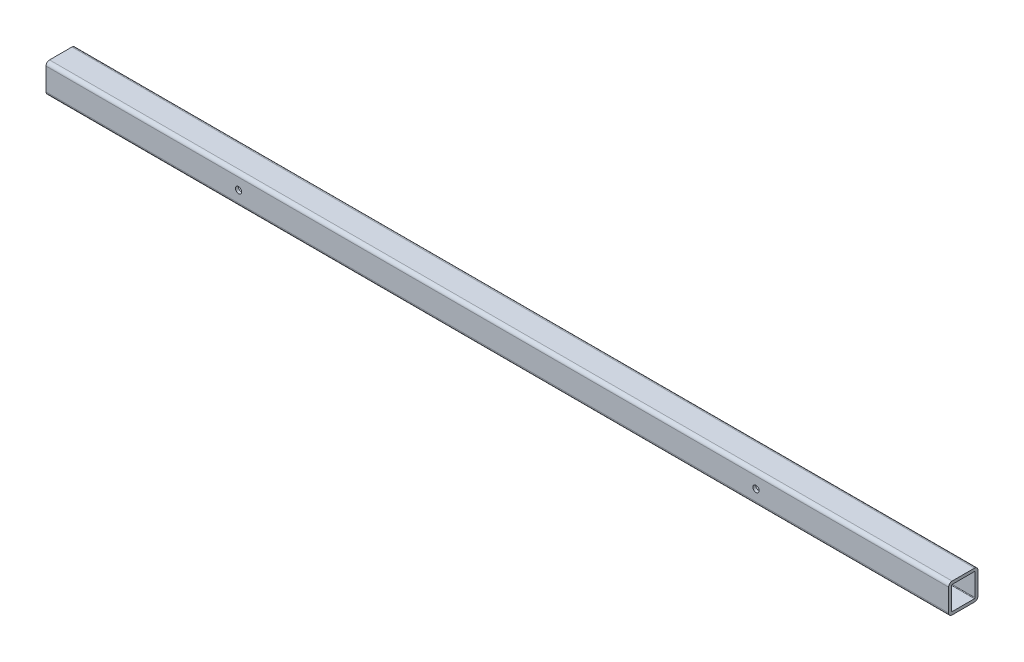
ISO-10303-21;
HEADER;
FILE_DESCRIPTION(('STEP AP214'),'2;1');
FILE_NAME('part.step','',(''),(''),'','','');
FILE_SCHEMA(('AUTOMOTIVE_DESIGN { 1 0 10303 214 1 1 1 1 }'));
ENDSEC;
DATA;
#1=APPLICATION_CONTEXT('core data for automotive mechanical design processes');
#2=APPLICATION_PROTOCOL_DEFINITION('international standard','automotive_design',2000,#1);
#3=PRODUCT_CONTEXT('',#1,'mechanical');
#4=PRODUCT('Part','Part','',(#3));
#5=PRODUCT_RELATED_PRODUCT_CATEGORY('part','',(#4));
#6=PRODUCT_DEFINITION_FORMATION('','',#4);
#7=PRODUCT_DEFINITION_CONTEXT('part definition',#1,'design');
#8=PRODUCT_DEFINITION('design','',#6,#7);
#9=PRODUCT_DEFINITION_SHAPE('','',#8);
#10=(LENGTH_UNIT() NAMED_UNIT(*) SI_UNIT(.MILLI.,.METRE.));
#11=(NAMED_UNIT(*) PLANE_ANGLE_UNIT() SI_UNIT($,.RADIAN.));
#12=(NAMED_UNIT(*) SI_UNIT($,.STERADIAN.) SOLID_ANGLE_UNIT());
#13=UNCERTAINTY_MEASURE_WITH_UNIT(LENGTH_MEASURE(1.E-05),#10,'distance_accuracy_value','');
#14=(GEOMETRIC_REPRESENTATION_CONTEXT(3) GLOBAL_UNCERTAINTY_ASSIGNED_CONTEXT((#13)) GLOBAL_UNIT_ASSIGNED_CONTEXT((#10,
#11,#12)) REPRESENTATION_CONTEXT('',''));
#15=CARTESIAN_POINT('',(0.,0.,0.));
#16=DIRECTION('',(0.,0.,1.));
#17=DIRECTION('',(1.,0.,0.));
#18=AXIS2_PLACEMENT_3D('',#15,#16,#17);
#19=CARTESIAN_POINT('',(-487.3625,3.81,27.94));
#20=DIRECTION('',(1.,0.,0.));
#21=DIRECTION('',(0.,0.,-1.));
#22=AXIS2_PLACEMENT_3D('',#19,#20,#21);
#23=CYLINDRICAL_SURFACE('',#22,0.635);
#24=DIRECTION('',(-1.,0.,0.));
#25=VECTOR('',#24,1.);
#26=CARTESIAN_POINT('',(-487.3625,3.81,28.575));
#27=LINE('',#26,#25);
#28=CARTESIAN_POINT('',(487.3625,3.81,28.575));
#29=VERTEX_POINT('',#28);
#30=CARTESIAN_POINT('',(-487.3625,3.81,28.575));
#31=VERTEX_POINT('',#30);
#32=EDGE_CURVE('E138',#29,#31,#27,.T.);
#33=ORIENTED_EDGE('',*,*,#32,.F.);
#34=CARTESIAN_POINT('',(487.3625,3.81,27.94));
#35=DIRECTION('',(1.,0.,0.));
#36=DIRECTION('',(0.,0.,-1.));
#37=AXIS2_PLACEMENT_3D('',#34,#35,#36);
#38=CIRCLE('',#37,0.635);
#39=CARTESIAN_POINT('',(487.3625,3.175,27.94));
#40=VERTEX_POINT('',#39);
#41=EDGE_CURVE('E19',#40,#29,#38,.F.);
#42=ORIENTED_EDGE('',*,*,#41,.F.);
#43=DIRECTION('',(1.,0.,0.));
#44=VECTOR('',#43,1.);
#45=CARTESIAN_POINT('',(-487.3625,3.175,27.94));
#46=LINE('',#45,#44);
#47=CARTESIAN_POINT('',(-487.3625,3.175,27.94));
#48=VERTEX_POINT('',#47);
#49=EDGE_CURVE('E218',#48,#40,#46,.T.);
#50=ORIENTED_EDGE('',*,*,#49,.F.);
#51=CARTESIAN_POINT('',(-487.3625,3.81,27.94));
#52=DIRECTION('',(1.,0.,0.));
#53=DIRECTION('',(0.,0.,-1.));
#54=AXIS2_PLACEMENT_3D('',#51,#52,#53);
#55=CIRCLE('',#54,0.635);
#56=EDGE_CURVE('E136',#31,#48,#55,.T.);
#57=ORIENTED_EDGE('',*,*,#56,.F.);
#58=EDGE_LOOP('',(#33,#42,#50,#57));
#59=FACE_BOUND('',#58,.T.);
#60=ADVANCED_FACE('F16',(#59),#23,.F.);
#61=CARTESIAN_POINT('',(-487.3625,27.94,27.94));
#62=DIRECTION('',(1.,0.,0.));
#63=DIRECTION('',(0.,0.,-1.));
#64=AXIS2_PLACEMENT_3D('',#61,#62,#63);
#65=CYLINDRICAL_SURFACE('',#64,0.635);
#66=DIRECTION('',(1.,0.,0.));
#67=VECTOR('',#66,1.);
#68=CARTESIAN_POINT('',(-487.3625,28.575,27.94));
#69=LINE('',#68,#67);
#70=CARTESIAN_POINT('',(487.3625,28.575,27.94));
#71=VERTEX_POINT('',#70);
#72=CARTESIAN_POINT('',(-487.3625,28.575,27.94));
#73=VERTEX_POINT('',#72);
#74=EDGE_CURVE('E207',#71,#73,#69,.F.);
#75=ORIENTED_EDGE('',*,*,#74,.F.);
#76=CARTESIAN_POINT('',(487.3625,27.94,27.94));
#77=DIRECTION('',(1.,0.,0.));
#78=DIRECTION('',(0.,0.,-1.));
#79=AXIS2_PLACEMENT_3D('',#76,#77,#78);
#80=CIRCLE('',#79,0.635);
#81=CARTESIAN_POINT('',(487.3625,27.94,28.575));
#82=VERTEX_POINT('',#81);
#83=EDGE_CURVE('E278',#82,#71,#80,.F.);
#84=ORIENTED_EDGE('',*,*,#83,.F.);
#85=DIRECTION('',(-1.,0.,0.));
#86=VECTOR('',#85,1.);
#87=CARTESIAN_POINT('',(-487.3625,27.94,28.575));
#88=LINE('',#87,#86);
#89=CARTESIAN_POINT('',(-487.3625,27.94,28.575));
#90=VERTEX_POINT('',#89);
#91=EDGE_CURVE('E143',#90,#82,#88,.F.);
#92=ORIENTED_EDGE('',*,*,#91,.F.);
#93=CARTESIAN_POINT('',(-487.3625,27.94,27.94));
#94=DIRECTION('',(1.,0.,0.));
#95=DIRECTION('',(0.,0.,-1.));
#96=AXIS2_PLACEMENT_3D('',#93,#94,#95);
#97=CIRCLE('',#96,0.635);
#98=EDGE_CURVE('E276',#73,#90,#97,.T.);
#99=ORIENTED_EDGE('',*,*,#98,.F.);
#100=EDGE_LOOP('',(#75,#84,#92,#99));
#101=FACE_BOUND('',#100,.T.);
#102=ADVANCED_FACE('F304',(#101),#65,.F.);
#103=CARTESIAN_POINT('',(-487.3625,3.81,3.81));
#104=DIRECTION('',(1.,0.,0.));
#105=DIRECTION('',(0.,0.,-1.));
#106=AXIS2_PLACEMENT_3D('',#103,#104,#105);
#107=CYLINDRICAL_SURFACE('',#106,0.635);
#108=DIRECTION('',(1.,0.,0.));
#109=VECTOR('',#108,1.);
#110=CARTESIAN_POINT('',(-487.3625,3.175,3.81));
#111=LINE('',#110,#109);
#112=CARTESIAN_POINT('',(487.3625,3.175,3.81));
#113=VERTEX_POINT('',#112);
#114=CARTESIAN_POINT('',(-487.3625,3.175,3.81));
#115=VERTEX_POINT('',#114);
#116=EDGE_CURVE('E215',#113,#115,#111,.F.);
#117=ORIENTED_EDGE('',*,*,#116,.F.);
#118=CARTESIAN_POINT('',(487.3625,3.81,3.81));
#119=DIRECTION('',(1.,0.,0.));
#120=DIRECTION('',(0.,0.,-1.));
#121=AXIS2_PLACEMENT_3D('',#118,#119,#120);
#122=CIRCLE('',#121,0.635);
#123=CARTESIAN_POINT('',(487.3625,3.81,3.175));
#124=VERTEX_POINT('',#123);
#125=EDGE_CURVE('E274',#124,#113,#122,.F.);
#126=ORIENTED_EDGE('',*,*,#125,.F.);
#127=DIRECTION('',(1.,0.,0.));
#128=VECTOR('',#127,1.);
#129=CARTESIAN_POINT('',(-487.3625,3.81,3.175));
#130=LINE('',#129,#128);
#131=CARTESIAN_POINT('',(-487.3625,3.81,3.175));
#132=VERTEX_POINT('',#131);
#133=EDGE_CURVE('E204',#132,#124,#130,.T.);
#134=ORIENTED_EDGE('',*,*,#133,.F.);
#135=CARTESIAN_POINT('',(-487.3625,3.81,3.81));
#136=DIRECTION('',(1.,0.,0.));
#137=DIRECTION('',(0.,0.,-1.));
#138=AXIS2_PLACEMENT_3D('',#135,#136,#137);
#139=CIRCLE('',#138,0.635);
#140=EDGE_CURVE('E272',#115,#132,#139,.T.);
#141=ORIENTED_EDGE('',*,*,#140,.F.);
#142=EDGE_LOOP('',(#117,#126,#134,#141));
#143=FACE_BOUND('',#142,.T.);
#144=ADVANCED_FACE('F288',(#143),#107,.F.);
#145=CARTESIAN_POINT('',(-487.3625,27.94,3.81));
#146=DIRECTION('',(1.,0.,0.));
#147=DIRECTION('',(0.,0.,-1.));
#148=AXIS2_PLACEMENT_3D('',#145,#146,#147);
#149=CYLINDRICAL_SURFACE('',#148,0.635);
#150=DIRECTION('',(1.,0.,0.));
#151=VECTOR('',#150,1.);
#152=CARTESIAN_POINT('',(-487.3625,27.94,3.175));
#153=LINE('',#152,#151);
#154=CARTESIAN_POINT('',(487.3625,27.94,3.175));
#155=VERTEX_POINT('',#154);
#156=CARTESIAN_POINT('',(-487.3625,27.94,3.175));
#157=VERTEX_POINT('',#156);
#158=EDGE_CURVE('E200',#155,#157,#153,.F.);
#159=ORIENTED_EDGE('',*,*,#158,.F.);
#160=CARTESIAN_POINT('',(487.3625,27.94,3.81));
#161=DIRECTION('',(1.,0.,0.));
#162=DIRECTION('',(0.,0.,-1.));
#163=AXIS2_PLACEMENT_3D('',#160,#161,#162);
#164=CIRCLE('',#163,0.635);
#165=CARTESIAN_POINT('',(487.3625,28.575,3.81));
#166=VERTEX_POINT('',#165);
#167=EDGE_CURVE('E270',#166,#155,#164,.F.);
#168=ORIENTED_EDGE('',*,*,#167,.F.);
#169=DIRECTION('',(1.,0.,0.));
#170=VECTOR('',#169,1.);
#171=CARTESIAN_POINT('',(-487.3625,28.575,3.81));
#172=LINE('',#171,#170);
#173=CARTESIAN_POINT('',(-487.3625,28.575,3.81));
#174=VERTEX_POINT('',#173);
#175=EDGE_CURVE('E210',#174,#166,#172,.T.);
#176=ORIENTED_EDGE('',*,*,#175,.F.);
#177=CARTESIAN_POINT('',(-487.3625,27.94,3.81));
#178=DIRECTION('',(1.,0.,0.));
#179=DIRECTION('',(0.,0.,-1.));
#180=AXIS2_PLACEMENT_3D('',#177,#178,#179);
#181=CIRCLE('',#180,0.635);
#182=EDGE_CURVE('E268',#157,#174,#181,.T.);
#183=ORIENTED_EDGE('',*,*,#182,.F.);
#184=EDGE_LOOP('',(#159,#168,#176,#183));
#185=FACE_BOUND('',#184,.T.);
#186=ADVANCED_FACE('F298',(#185),#149,.F.);
#187=CARTESIAN_POINT('',(-279.4,15.875,31.75));
#188=DIRECTION('',(0.,0.,1.));
#189=DIRECTION('',(1.,0.,0.));
#190=AXIS2_PLACEMENT_3D('',#187,#188,#189);
#191=CYLINDRICAL_SURFACE('',#190,3.3655);
#192=CARTESIAN_POINT('',(-279.4,15.875,3.175));
#193=DIRECTION('',(0.,0.,1.));
#194=DIRECTION('',(1.,0.,0.));
#195=AXIS2_PLACEMENT_3D('',#192,#193,#194);
#196=CIRCLE('',#195,3.3655);
#197=CARTESIAN_POINT('',(-276.0345,15.875,3.175));
#198=VERTEX_POINT('',#197);
#199=EDGE_CURVE('E203',#198,#198,#196,.F.);
#200=ORIENTED_EDGE('',*,*,#199,.F.);
#201=EDGE_LOOP('',(#200));
#202=FACE_BOUND('',#201,.T.);
#203=CARTESIAN_POINT('',(-279.4,15.875,0.));
#204=DIRECTION('',(0.,0.,1.));
#205=DIRECTION('',(1.,0.,0.));
#206=AXIS2_PLACEMENT_3D('',#203,#204,#205);
#207=CIRCLE('',#206,3.3655);
#208=CARTESIAN_POINT('',(-276.0345,15.875,0.));
#209=VERTEX_POINT('',#208);
#210=EDGE_CURVE('E265',#209,#209,#207,.T.);
#211=ORIENTED_EDGE('',*,*,#210,.F.);
#212=EDGE_LOOP('',(#211));
#213=FACE_BOUND('',#212,.T.);
#214=ADVANCED_FACE('F372',(#202,#213),#191,.F.);
#215=CARTESIAN_POINT('',(279.4,15.875,31.75));
#216=DIRECTION('',(0.,0.,1.));
#217=DIRECTION('',(1.,0.,0.));
#218=AXIS2_PLACEMENT_3D('',#215,#216,#217);
#219=CYLINDRICAL_SURFACE('',#218,3.3655);
#220=CARTESIAN_POINT('',(279.4,15.875,3.175));
#221=DIRECTION('',(0.,0.,1.));
#222=DIRECTION('',(1.,0.,0.));
#223=AXIS2_PLACEMENT_3D('',#220,#221,#222);
#224=CIRCLE('',#223,3.3655);
#225=CARTESIAN_POINT('',(282.7655,15.875,3.175));
#226=VERTEX_POINT('',#225);
#227=EDGE_CURVE('E227',#226,#226,#224,.F.);
#228=ORIENTED_EDGE('',*,*,#227,.F.);
#229=EDGE_LOOP('',(#228));
#230=FACE_BOUND('',#229,.T.);
#231=CARTESIAN_POINT('',(279.4,15.875,0.));
#232=DIRECTION('',(0.,0.,1.));
#233=DIRECTION('',(1.,0.,0.));
#234=AXIS2_PLACEMENT_3D('',#231,#232,#233);
#235=CIRCLE('',#234,3.3655);
#236=CARTESIAN_POINT('',(282.7655,15.875,0.));
#237=VERTEX_POINT('',#236);
#238=EDGE_CURVE('E235',#237,#237,#235,.T.);
#239=ORIENTED_EDGE('',*,*,#238,.F.);
#240=EDGE_LOOP('',(#239));
#241=FACE_BOUND('',#240,.T.);
#242=ADVANCED_FACE('F368',(#230,#241),#219,.F.);
#243=CARTESIAN_POINT('',(-279.4,15.875,31.75));
#244=DIRECTION('',(0.,0.,1.));
#245=DIRECTION('',(1.,0.,0.));
#246=AXIS2_PLACEMENT_3D('',#243,#244,#245);
#247=CYLINDRICAL_SURFACE('',#246,3.3655);
#248=CARTESIAN_POINT('',(-279.4,15.875,28.575));
#249=DIRECTION('',(0.,0.,1.));
#250=DIRECTION('',(1.,0.,0.));
#251=AXIS2_PLACEMENT_3D('',#248,#249,#250);
#252=CIRCLE('',#251,3.3655);
#253=CARTESIAN_POINT('',(-276.0345,15.875,28.575));
#254=VERTEX_POINT('',#253);
#255=EDGE_CURVE('E142',#254,#254,#252,.T.);
#256=ORIENTED_EDGE('',*,*,#255,.F.);
#257=EDGE_LOOP('',(#256));
#258=FACE_BOUND('',#257,.T.);
#259=CARTESIAN_POINT('',(-279.4,15.875,31.75));
#260=DIRECTION('',(0.,0.,1.));
#261=DIRECTION('',(1.,0.,0.));
#262=AXIS2_PLACEMENT_3D('',#259,#260,#261);
#263=CIRCLE('',#262,3.3655);
#264=CARTESIAN_POINT('',(-276.0345,15.875,31.75));
#265=VERTEX_POINT('',#264);
#266=EDGE_CURVE('E226',#265,#265,#263,.F.);
#267=ORIENTED_EDGE('',*,*,#266,.F.);
#268=EDGE_LOOP('',(#267));
#269=FACE_BOUND('',#268,.T.);
#270=ADVANCED_FACE('F364',(#258,#269),#247,.F.);
#271=CARTESIAN_POINT('',(279.4,15.875,31.75));
#272=DIRECTION('',(0.,0.,1.));
#273=DIRECTION('',(1.,0.,0.));
#274=AXIS2_PLACEMENT_3D('',#271,#272,#273);
#275=CYLINDRICAL_SURFACE('',#274,3.3655);
#276=CARTESIAN_POINT('',(279.4,15.875,28.575));
#277=DIRECTION('',(0.,0.,1.));
#278=DIRECTION('',(1.,0.,0.));
#279=AXIS2_PLACEMENT_3D('',#276,#277,#278);
#280=CIRCLE('',#279,3.3655);
#281=CARTESIAN_POINT('',(282.7655,15.875,28.575));
#282=VERTEX_POINT('',#281);
#283=EDGE_CURVE('E212',#282,#282,#280,.T.);
#284=ORIENTED_EDGE('',*,*,#283,.F.);
#285=EDGE_LOOP('',(#284));
#286=FACE_BOUND('',#285,.T.);
#287=CARTESIAN_POINT('',(279.4,15.875,31.75));
#288=DIRECTION('',(0.,0.,1.));
#289=DIRECTION('',(1.,0.,0.));
#290=AXIS2_PLACEMENT_3D('',#287,#288,#289);
#291=CIRCLE('',#290,3.3655);
#292=CARTESIAN_POINT('',(282.7655,15.875,31.75));
#293=VERTEX_POINT('',#292);
#294=EDGE_CURVE('E250',#293,#293,#291,.F.);
#295=ORIENTED_EDGE('',*,*,#294,.F.);
#296=EDGE_LOOP('',(#295));
#297=FACE_BOUND('',#296,.T.);
#298=ADVANCED_FACE('F360',(#286,#297),#275,.F.);
#299=CARTESIAN_POINT('',(-487.3625,3.81,0.));
#300=DIRECTION('',(0.,0.,-1.));
#301=DIRECTION('',(-1.,0.,0.));
#302=AXIS2_PLACEMENT_3D('',#299,#300,#301);
#303=PLANE('',#302);
#304=ORIENTED_EDGE('',*,*,#238,.T.);
#305=EDGE_LOOP('',(#304));
#306=FACE_BOUND('',#305,.T.);
#307=ORIENTED_EDGE('',*,*,#210,.T.);
#308=EDGE_LOOP('',(#307));
#309=FACE_BOUND('',#308,.T.);
#310=DIRECTION('',(0.,1.,0.));
#311=VECTOR('',#310,1.);
#312=CARTESIAN_POINT('',(487.3625,0.,0.));
#313=LINE('',#312,#311);
#314=CARTESIAN_POINT('',(487.3625,3.81,0.));
#315=VERTEX_POINT('',#314);
#316=CARTESIAN_POINT('',(487.3625,27.94,0.));
#317=VERTEX_POINT('',#316);
#318=EDGE_CURVE('E164',#315,#317,#313,.T.);
#319=ORIENTED_EDGE('',*,*,#318,.F.);
#320=DIRECTION('',(1.,0.,0.));
#321=VECTOR('',#320,1.);
#322=CARTESIAN_POINT('',(-487.3625,3.81,0.));
#323=LINE('',#322,#321);
#324=CARTESIAN_POINT('',(-487.3625,3.81,0.));
#325=VERTEX_POINT('',#324);
#326=EDGE_CURVE('E167',#325,#315,#323,.T.);
#327=ORIENTED_EDGE('',*,*,#326,.F.);
#328=DIRECTION('',(0.,1.,0.));
#329=VECTOR('',#328,1.);
#330=CARTESIAN_POINT('',(-487.3625,0.,0.));
#331=LINE('',#330,#329);
#332=CARTESIAN_POINT('',(-487.3625,27.94,0.));
#333=VERTEX_POINT('',#332);
#334=EDGE_CURVE('E189',#325,#333,#331,.T.);
#335=ORIENTED_EDGE('',*,*,#334,.T.);
#336=DIRECTION('',(1.,0.,0.));
#337=VECTOR('',#336,1.);
#338=CARTESIAN_POINT('',(-487.3625,27.94,0.));
#339=LINE('',#338,#337);
#340=EDGE_CURVE('E233',#317,#333,#339,.F.);
#341=ORIENTED_EDGE('',*,*,#340,.F.);
#342=EDGE_LOOP('',(#319,#327,#335,#341));
#343=FACE_BOUND('',#342,.T.);
#344=ADVANCED_FACE('F356',(#306,#309,#343),#303,.T.);
#345=CARTESIAN_POINT('',(-487.3625,27.94,3.81));
#346=DIRECTION('',(1.,0.,0.));
#347=DIRECTION('',(0.,0.,-1.));
#348=AXIS2_PLACEMENT_3D('',#345,#346,#347);
#349=CYLINDRICAL_SURFACE('',#348,3.81);
#350=CARTESIAN_POINT('',(487.3625,27.94,3.81));
#351=DIRECTION('',(1.,0.,0.));
#352=DIRECTION('',(0.,0.,-1.));
#353=AXIS2_PLACEMENT_3D('',#350,#351,#352);
#354=CIRCLE('',#353,3.81);
#355=CARTESIAN_POINT('',(487.3625,31.75,3.81));
#356=VERTEX_POINT('',#355);
#357=EDGE_CURVE('E163',#317,#356,#354,.T.);
#358=ORIENTED_EDGE('',*,*,#357,.F.);
#359=ORIENTED_EDGE('',*,*,#340,.T.);
#360=CARTESIAN_POINT('',(-487.3625,27.94,3.81));
#361=DIRECTION('',(1.,0.,0.));
#362=DIRECTION('',(0.,0.,-1.));
#363=AXIS2_PLACEMENT_3D('',#360,#361,#362);
#364=CIRCLE('',#363,3.81);
#365=CARTESIAN_POINT('',(-487.3625,31.75,3.81));
#366=VERTEX_POINT('',#365);
#367=EDGE_CURVE('E197',#333,#366,#364,.T.);
#368=ORIENTED_EDGE('',*,*,#367,.T.);
#369=DIRECTION('',(1.,0.,0.));
#370=VECTOR('',#369,1.);
#371=CARTESIAN_POINT('',(-487.3625,31.75,3.81));
#372=LINE('',#371,#370);
#373=EDGE_CURVE('E230',#356,#366,#372,.F.);
#374=ORIENTED_EDGE('',*,*,#373,.F.);
#375=EDGE_LOOP('',(#358,#359,#368,#374));
#376=FACE_BOUND('',#375,.T.);
#377=ADVANCED_FACE('F352',(#376),#349,.T.);
#378=CARTESIAN_POINT('',(-487.3625,31.75,3.81));
#379=DIRECTION('',(0.,1.,0.));
#380=DIRECTION('',(0.,0.,1.));
#381=AXIS2_PLACEMENT_3D('',#378,#379,#380);
#382=PLANE('',#381);
#383=DIRECTION('',(0.,0.,-1.));
#384=VECTOR('',#383,1.);
#385=CARTESIAN_POINT('',(487.3625,31.75,0.));
#386=LINE('',#385,#384);
#387=CARTESIAN_POINT('',(487.3625,31.75,27.94));
#388=VERTEX_POINT('',#387);
#389=EDGE_CURVE('E160',#356,#388,#386,.F.);
#390=ORIENTED_EDGE('',*,*,#389,.F.);
#391=ORIENTED_EDGE('',*,*,#373,.T.);
#392=DIRECTION('',(0.,0.,-1.));
#393=VECTOR('',#392,1.);
#394=CARTESIAN_POINT('',(-487.3625,31.75,0.));
#395=LINE('',#394,#393);
#396=CARTESIAN_POINT('',(-487.3625,31.75,27.94));
#397=VERTEX_POINT('',#396);
#398=EDGE_CURVE('E195',#366,#397,#395,.F.);
#399=ORIENTED_EDGE('',*,*,#398,.T.);
#400=DIRECTION('',(1.,0.,0.));
#401=VECTOR('',#400,1.);
#402=CARTESIAN_POINT('',(-487.3625,31.75,27.94));
#403=LINE('',#402,#401);
#404=EDGE_CURVE('E220',#388,#397,#403,.F.);
#405=ORIENTED_EDGE('',*,*,#404,.F.);
#406=EDGE_LOOP('',(#390,#391,#399,#405));
#407=FACE_BOUND('',#406,.T.);
#408=ADVANCED_FACE('F348',(#407),#382,.T.);
#409=CARTESIAN_POINT('',(-487.3625,27.94,27.94));
#410=DIRECTION('',(1.,0.,0.));
#411=DIRECTION('',(0.,0.,-1.));
#412=AXIS2_PLACEMENT_3D('',#409,#410,#411);
#413=CYLINDRICAL_SURFACE('',#412,3.81);
#414=CARTESIAN_POINT('',(487.3625,27.94,27.94));
#415=DIRECTION('',(1.,0.,0.));
#416=DIRECTION('',(0.,0.,-1.));
#417=AXIS2_PLACEMENT_3D('',#414,#415,#416);
#418=CIRCLE('',#417,3.81);
#419=CARTESIAN_POINT('',(487.3625,27.94,31.75));
#420=VERTEX_POINT('',#419);
#421=EDGE_CURVE('E159',#388,#420,#418,.T.);
#422=ORIENTED_EDGE('',*,*,#421,.F.);
#423=ORIENTED_EDGE('',*,*,#404,.T.);
#424=CARTESIAN_POINT('',(-487.3625,27.94,27.94));
#425=DIRECTION('',(1.,0.,0.));
#426=DIRECTION('',(0.,0.,-1.));
#427=AXIS2_PLACEMENT_3D('',#424,#425,#426);
#428=CIRCLE('',#427,3.81);
#429=CARTESIAN_POINT('',(-487.3625,27.94,31.75));
#430=VERTEX_POINT('',#429);
#431=EDGE_CURVE('E194',#397,#430,#428,.T.);
#432=ORIENTED_EDGE('',*,*,#431,.T.);
#433=DIRECTION('',(1.,0.,0.));
#434=VECTOR('',#433,1.);
#435=CARTESIAN_POINT('',(-487.3625,27.94,31.75));
#436=LINE('',#435,#434);
#437=EDGE_CURVE('E223',#420,#430,#436,.F.);
#438=ORIENTED_EDGE('',*,*,#437,.F.);
#439=EDGE_LOOP('',(#422,#423,#432,#438));
#440=FACE_BOUND('',#439,.T.);
#441=ADVANCED_FACE('F345',(#440),#413,.T.);
#442=CARTESIAN_POINT('',(-487.3625,3.175,3.81));
#443=DIRECTION('',(0.,1.,0.));
#444=DIRECTION('',(0.,0.,1.));
#445=AXIS2_PLACEMENT_3D('',#442,#443,#444);
#446=PLANE('',#445);
#447=DIRECTION('',(0.,0.,-1.));
#448=VECTOR('',#447,1.);
#449=CARTESIAN_POINT('',(487.3625,3.175,0.));
#450=LINE('',#449,#448);
#451=EDGE_CURVE('E135',#113,#40,#450,.F.);
#452=ORIENTED_EDGE('',*,*,#451,.F.);
#453=ORIENTED_EDGE('',*,*,#116,.T.);
#454=DIRECTION('',(0.,0.,-1.));
#455=VECTOR('',#454,1.);
#456=CARTESIAN_POINT('',(-487.3625,3.175,0.));
#457=LINE('',#456,#455);
#458=EDGE_CURVE('E186',#115,#48,#457,.F.);
#459=ORIENTED_EDGE('',*,*,#458,.T.);
#460=ORIENTED_EDGE('',*,*,#49,.T.);
#461=EDGE_LOOP('',(#452,#453,#459,#460));
#462=FACE_BOUND('',#461,.T.);
#463=ADVANCED_FACE('F285',(#462),#446,.T.);
#464=CARTESIAN_POINT('',(-487.3625,3.81,28.575));
#465=DIRECTION('',(0.,0.,-1.));
#466=DIRECTION('',(-1.,0.,0.));
#467=AXIS2_PLACEMENT_3D('',#464,#465,#466);
#468=PLANE('',#467);
#469=ORIENTED_EDGE('',*,*,#283,.T.);
#470=EDGE_LOOP('',(#469));
#471=FACE_BOUND('',#470,.T.);
#472=ORIENTED_EDGE('',*,*,#255,.T.);
#473=EDGE_LOOP('',(#472));
#474=FACE_BOUND('',#473,.T.);
#475=DIRECTION('',(0.,1.,0.));
#476=VECTOR('',#475,1.);
#477=CARTESIAN_POINT('',(487.3625,0.,28.575));
#478=LINE('',#477,#476);
#479=EDGE_CURVE('E133',#29,#82,#478,.T.);
#480=ORIENTED_EDGE('',*,*,#479,.F.);
#481=ORIENTED_EDGE('',*,*,#32,.T.);
#482=DIRECTION('',(0.,1.,0.));
#483=VECTOR('',#482,1.);
#484=CARTESIAN_POINT('',(-487.3625,0.,28.575));
#485=LINE('',#484,#483);
#486=EDGE_CURVE('E184',#31,#90,#485,.T.);
#487=ORIENTED_EDGE('',*,*,#486,.T.);
#488=ORIENTED_EDGE('',*,*,#91,.T.);
#489=EDGE_LOOP('',(#480,#481,#487,#488));
#490=FACE_BOUND('',#489,.T.);
#491=ADVANCED_FACE('F146',(#471,#474,#490),#468,.T.);
#492=CARTESIAN_POINT('',(-487.3625,28.575,27.94));
#493=DIRECTION('',(0.,-1.,0.));
#494=DIRECTION('',(0.,0.,-1.));
#495=AXIS2_PLACEMENT_3D('',#492,#493,#494);
#496=PLANE('',#495);
#497=DIRECTION('',(0.,0.,-1.));
#498=VECTOR('',#497,1.);
#499=CARTESIAN_POINT('',(487.3625,28.575,0.));
#500=LINE('',#499,#498);
#501=EDGE_CURVE('E148',#71,#166,#500,.T.);
#502=ORIENTED_EDGE('',*,*,#501,.F.);
#503=ORIENTED_EDGE('',*,*,#74,.T.);
#504=DIRECTION('',(0.,0.,-1.));
#505=VECTOR('',#504,1.);
#506=CARTESIAN_POINT('',(-487.3625,28.575,0.));
#507=LINE('',#506,#505);
#508=EDGE_CURVE('E181',#73,#174,#507,.T.);
#509=ORIENTED_EDGE('',*,*,#508,.T.);
#510=ORIENTED_EDGE('',*,*,#175,.T.);
#511=EDGE_LOOP('',(#502,#503,#509,#510));
#512=FACE_BOUND('',#511,.T.);
#513=ADVANCED_FACE('F301',(#512),#496,.T.);
#514=CARTESIAN_POINT('',(-487.3625,27.94,3.175));
#515=DIRECTION('',(0.,0.,1.));
#516=DIRECTION('',(1.,0.,0.));
#517=AXIS2_PLACEMENT_3D('',#514,#515,#516);
#518=PLANE('',#517);
#519=ORIENTED_EDGE('',*,*,#227,.T.);
#520=EDGE_LOOP('',(#519));
#521=FACE_BOUND('',#520,.T.);
#522=ORIENTED_EDGE('',*,*,#199,.T.);
#523=EDGE_LOOP('',(#522));
#524=FACE_BOUND('',#523,.T.);
#525=DIRECTION('',(0.,1.,0.));
#526=VECTOR('',#525,1.);
#527=CARTESIAN_POINT('',(487.3625,0.,3.175));
#528=LINE('',#527,#526);
#529=EDGE_CURVE('E151',#155,#124,#528,.F.);
#530=ORIENTED_EDGE('',*,*,#529,.F.);
#531=ORIENTED_EDGE('',*,*,#158,.T.);
#532=DIRECTION('',(0.,1.,0.));
#533=VECTOR('',#532,1.);
#534=CARTESIAN_POINT('',(-487.3625,0.,3.175));
#535=LINE('',#534,#533);
#536=EDGE_CURVE('E177',#157,#132,#535,.F.);
#537=ORIENTED_EDGE('',*,*,#536,.T.);
#538=ORIENTED_EDGE('',*,*,#133,.T.);
#539=EDGE_LOOP('',(#530,#531,#537,#538));
#540=FACE_BOUND('',#539,.T.);
#541=ADVANCED_FACE('F294',(#521,#524,#540),#518,.T.);
#542=CARTESIAN_POINT('',(-487.3625,27.94,31.75));
#543=DIRECTION('',(0.,0.,1.));
#544=DIRECTION('',(1.,0.,0.));
#545=AXIS2_PLACEMENT_3D('',#542,#543,#544);
#546=PLANE('',#545);
#547=ORIENTED_EDGE('',*,*,#294,.T.);
#548=EDGE_LOOP('',(#547));
#549=FACE_BOUND('',#548,.T.);
#550=ORIENTED_EDGE('',*,*,#266,.T.);
#551=EDGE_LOOP('',(#550));
#552=FACE_BOUND('',#551,.T.);
#553=DIRECTION('',(0.,1.,0.));
#554=VECTOR('',#553,1.);
#555=CARTESIAN_POINT('',(487.3625,0.,31.75));
#556=LINE('',#555,#554);
#557=CARTESIAN_POINT('',(487.3625,3.81,31.75));
#558=VERTEX_POINT('',#557);
#559=EDGE_CURVE('E157',#420,#558,#556,.F.);
#560=ORIENTED_EDGE('',*,*,#559,.F.);
#561=ORIENTED_EDGE('',*,*,#437,.T.);
#562=DIRECTION('',(0.,1.,0.));
#563=VECTOR('',#562,1.);
#564=CARTESIAN_POINT('',(-487.3625,0.,31.75));
#565=LINE('',#564,#563);
#566=CARTESIAN_POINT('',(-487.3625,3.81,31.75));
#567=VERTEX_POINT('',#566);
#568=EDGE_CURVE('E192',#430,#567,#565,.F.);
#569=ORIENTED_EDGE('',*,*,#568,.T.);
#570=DIRECTION('',(1.,0.,0.));
#571=VECTOR('',#570,1.);
#572=CARTESIAN_POINT('',(-487.3625,3.81,31.75));
#573=LINE('',#572,#571);
#574=EDGE_CURVE('E176',#558,#567,#573,.F.);
#575=ORIENTED_EDGE('',*,*,#574,.F.);
#576=EDGE_LOOP('',(#560,#561,#569,#575));
#577=FACE_BOUND('',#576,.T.);
#578=ADVANCED_FACE('F331',(#549,#552,#577),#546,.T.);
#579=CARTESIAN_POINT('',(-487.3625,0.,0.));
#580=DIRECTION('',(1.,0.,0.));
#581=DIRECTION('',(0.,0.,-1.));
#582=AXIS2_PLACEMENT_3D('',#579,#580,#581);
#583=PLANE('',#582);
#584=ORIENTED_EDGE('',*,*,#536,.F.);
#585=ORIENTED_EDGE('',*,*,#182,.T.);
#586=ORIENTED_EDGE('',*,*,#508,.F.);
#587=ORIENTED_EDGE('',*,*,#98,.T.);
#588=ORIENTED_EDGE('',*,*,#486,.F.);
#589=ORIENTED_EDGE('',*,*,#56,.T.);
#590=ORIENTED_EDGE('',*,*,#458,.F.);
#591=ORIENTED_EDGE('',*,*,#140,.T.);
#592=EDGE_LOOP('',(#584,#585,#586,#587,#588,#589,#590,#591));
#593=FACE_BOUND('',#592,.T.);
#594=CARTESIAN_POINT('',(-487.3625,3.81,3.81));
#595=DIRECTION('',(1.,0.,0.));
#596=DIRECTION('',(0.,0.,-1.));
#597=AXIS2_PLACEMENT_3D('',#594,#595,#596);
#598=CIRCLE('',#597,3.81);
#599=CARTESIAN_POINT('',(-487.3625,0.,3.81));
#600=VERTEX_POINT('',#599);
#601=EDGE_CURVE('E180',#600,#325,#598,.T.);
#602=ORIENTED_EDGE('',*,*,#601,.F.);
#603=DIRECTION('',(0.,0.,-1.));
#604=VECTOR('',#603,1.);
#605=CARTESIAN_POINT('',(-487.3625,0.,27.94));
#606=LINE('',#605,#604);
#607=CARTESIAN_POINT('',(-487.3625,0.,27.94));
#608=VERTEX_POINT('',#607);
#609=EDGE_CURVE('E171',#608,#600,#606,.T.);
#610=ORIENTED_EDGE('',*,*,#609,.F.);
#611=CARTESIAN_POINT('',(-487.3625,3.81,27.94));
#612=DIRECTION('',(1.,0.,0.));
#613=DIRECTION('',(0.,0.,-1.));
#614=AXIS2_PLACEMENT_3D('',#611,#612,#613);
#615=CIRCLE('',#614,3.81);
#616=EDGE_CURVE('E237',#567,#608,#615,.T.);
#617=ORIENTED_EDGE('',*,*,#616,.F.);
#618=ORIENTED_EDGE('',*,*,#568,.F.);
#619=ORIENTED_EDGE('',*,*,#431,.F.);
#620=ORIENTED_EDGE('',*,*,#398,.F.);
#621=ORIENTED_EDGE('',*,*,#367,.F.);
#622=ORIENTED_EDGE('',*,*,#334,.F.);
#623=EDGE_LOOP('',(#602,#610,#617,#618,#619,#620,#621,#622));
#624=FACE_BOUND('',#623,.T.);
#625=ADVANCED_FACE('F282',(#593,#624),#583,.F.);
#626=CARTESIAN_POINT('',(-487.3625,3.81,3.81));
#627=DIRECTION('',(1.,0.,0.));
#628=DIRECTION('',(0.,0.,-1.));
#629=AXIS2_PLACEMENT_3D('',#626,#627,#628);
#630=CYLINDRICAL_SURFACE('',#629,3.81);
#631=CARTESIAN_POINT('',(487.3625,3.81,3.81));
#632=DIRECTION('',(1.,0.,0.));
#633=DIRECTION('',(0.,0.,-1.));
#634=AXIS2_PLACEMENT_3D('',#631,#632,#633);
#635=CIRCLE('',#634,3.81);
#636=CARTESIAN_POINT('',(487.3625,0.,3.81));
#637=VERTEX_POINT('',#636);
#638=EDGE_CURVE('E153',#637,#315,#635,.T.);
#639=ORIENTED_EDGE('',*,*,#638,.F.);
#640=DIRECTION('',(1.,0.,0.));
#641=VECTOR('',#640,1.);
#642=CARTESIAN_POINT('',(-487.3625,0.,3.81));
#643=LINE('',#642,#641);
#644=EDGE_CURVE('E168',#600,#637,#643,.T.);
#645=ORIENTED_EDGE('',*,*,#644,.F.);
#646=ORIENTED_EDGE('',*,*,#601,.T.);
#647=ORIENTED_EDGE('',*,*,#326,.T.);
#648=EDGE_LOOP('',(#639,#645,#646,#647));
#649=FACE_BOUND('',#648,.T.);
#650=ADVANCED_FACE('F325',(#649),#630,.T.);
#651=CARTESIAN_POINT('',(487.3625,0.,0.));
#652=DIRECTION('',(1.,0.,0.));
#653=DIRECTION('',(0.,0.,-1.));
#654=AXIS2_PLACEMENT_3D('',#651,#652,#653);
#655=PLANE('',#654);
#656=ORIENTED_EDGE('',*,*,#167,.T.);
#657=ORIENTED_EDGE('',*,*,#529,.T.);
#658=ORIENTED_EDGE('',*,*,#125,.T.);
#659=ORIENTED_EDGE('',*,*,#451,.T.);
#660=ORIENTED_EDGE('',*,*,#41,.T.);
#661=ORIENTED_EDGE('',*,*,#479,.T.);
#662=ORIENTED_EDGE('',*,*,#83,.T.);
#663=ORIENTED_EDGE('',*,*,#501,.T.);
#664=EDGE_LOOP('',(#656,#657,#658,#659,#660,#661,#662,#663));
#665=FACE_BOUND('',#664,.T.);
#666=DIRECTION('',(0.,0.,-1.));
#667=VECTOR('',#666,1.);
#668=CARTESIAN_POINT('',(487.3625,0.,27.94));
#669=LINE('',#668,#667);
#670=CARTESIAN_POINT('',(487.3625,0.,27.94));
#671=VERTEX_POINT('',#670);
#672=EDGE_CURVE('E25',#637,#671,#669,.F.);
#673=ORIENTED_EDGE('',*,*,#672,.F.);
#674=ORIENTED_EDGE('',*,*,#638,.T.);
#675=ORIENTED_EDGE('',*,*,#318,.T.);
#676=ORIENTED_EDGE('',*,*,#357,.T.);
#677=ORIENTED_EDGE('',*,*,#389,.T.);
#678=ORIENTED_EDGE('',*,*,#421,.T.);
#679=ORIENTED_EDGE('',*,*,#559,.T.);
#680=CARTESIAN_POINT('',(487.3625,3.81,27.94));
#681=DIRECTION('',(1.,0.,0.));
#682=DIRECTION('',(0.,0.,-1.));
#683=AXIS2_PLACEMENT_3D('',#680,#681,#682);
#684=CIRCLE('',#683,3.81);
#685=EDGE_CURVE('E34',#671,#558,#684,.F.);
#686=ORIENTED_EDGE('',*,*,#685,.F.);
#687=EDGE_LOOP('',(#673,#674,#675,#676,#677,#678,#679,#686));
#688=FACE_BOUND('',#687,.T.);
#689=ADVANCED_FACE('F131',(#665,#688),#655,.T.);
#690=CARTESIAN_POINT('',(-487.3625,3.81,27.94));
#691=DIRECTION('',(1.,0.,0.));
#692=DIRECTION('',(0.,0.,-1.));
#693=AXIS2_PLACEMENT_3D('',#690,#691,#692);
#694=CYLINDRICAL_SURFACE('',#693,3.81);
#695=ORIENTED_EDGE('',*,*,#685,.T.);
#696=ORIENTED_EDGE('',*,*,#574,.T.);
#697=ORIENTED_EDGE('',*,*,#616,.T.);
#698=DIRECTION('',(1.,0.,0.));
#699=VECTOR('',#698,1.);
#700=CARTESIAN_POINT('',(-487.3625,0.,27.94));
#701=LINE('',#700,#699);
#702=EDGE_CURVE('E11',#671,#608,#701,.F.);
#703=ORIENTED_EDGE('',*,*,#702,.F.);
#704=EDGE_LOOP('',(#695,#696,#697,#703));
#705=FACE_BOUND('',#704,.T.);
#706=ADVANCED_FACE('F314',(#705),#694,.T.);
#707=CARTESIAN_POINT('',(-487.3625,0.,27.94));
#708=DIRECTION('',(0.,-1.,0.));
#709=DIRECTION('',(0.,0.,-1.));
#710=AXIS2_PLACEMENT_3D('',#707,#708,#709);
#711=PLANE('',#710);
#712=ORIENTED_EDGE('',*,*,#672,.T.);
#713=ORIENTED_EDGE('',*,*,#702,.T.);
#714=ORIENTED_EDGE('',*,*,#609,.T.);
#715=ORIENTED_EDGE('',*,*,#644,.T.);
#716=EDGE_LOOP('',(#712,#713,#714,#715));
#717=FACE_BOUND('',#716,.T.);
#718=ADVANCED_FACE('F312',(#717),#711,.T.);
#719=CLOSED_SHELL('',(#60,#102,#144,#186,#214,#242,#270,#298,#344,#377,#408,#441,#463,#491,#513,
#541,#578,#625,#650,#689,#706,#718));
#720=MANIFOLD_SOLID_BREP('B1',#719);
#721=ADVANCED_BREP_SHAPE_REPRESENTATION('',(#18,#720),#14);
#722=SHAPE_DEFINITION_REPRESENTATION(#9,#721);
ENDSEC;
END-ISO-10303-21;
